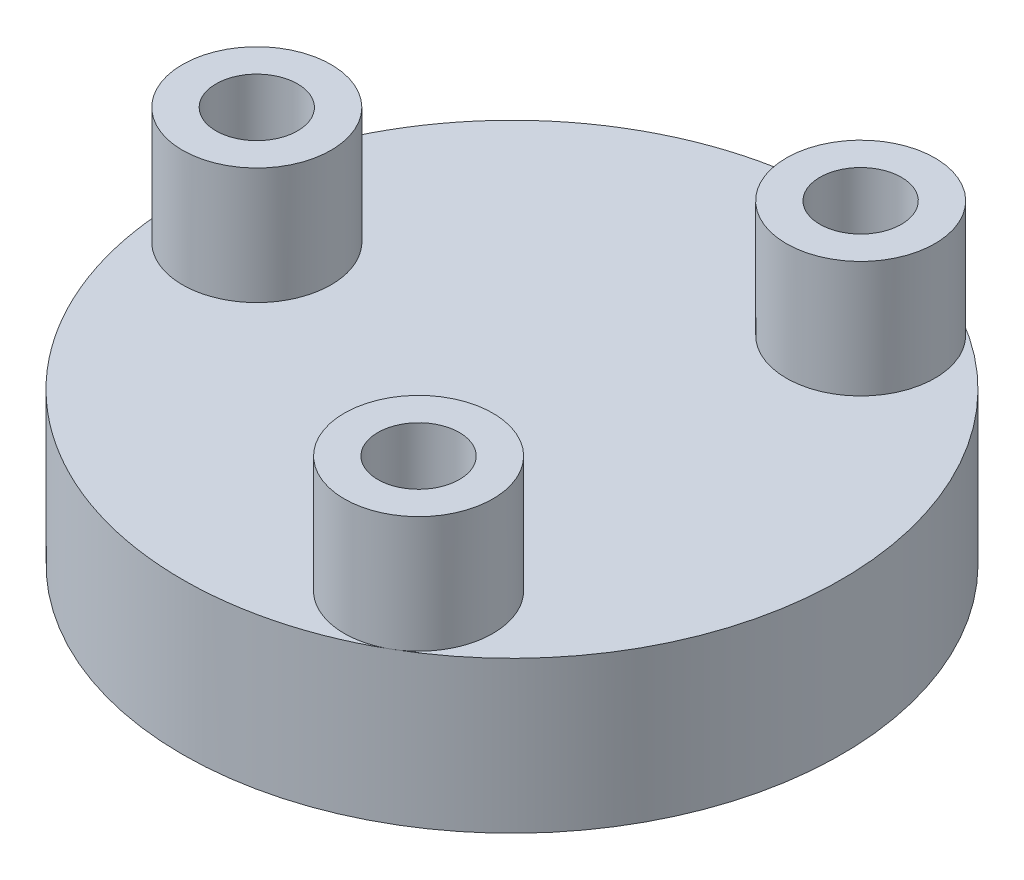
ISO-10303-21;
HEADER;
FILE_DESCRIPTION(('STEP AP214'),'2;1');
FILE_NAME('part.step','',(''),(''),'','','');
FILE_SCHEMA(('AUTOMOTIVE_DESIGN { 1 0 10303 214 1 1 1 1 }'));
ENDSEC;
DATA;
#1=APPLICATION_CONTEXT('core data for automotive mechanical design processes');
#2=APPLICATION_PROTOCOL_DEFINITION('international standard','automotive_design',2000,#1);
#3=PRODUCT_CONTEXT('',#1,'mechanical');
#4=PRODUCT('Part','Part','',(#3));
#5=PRODUCT_RELATED_PRODUCT_CATEGORY('part','',(#4));
#6=PRODUCT_DEFINITION_FORMATION('','',#4);
#7=PRODUCT_DEFINITION_CONTEXT('part definition',#1,'design');
#8=PRODUCT_DEFINITION('design','',#6,#7);
#9=PRODUCT_DEFINITION_SHAPE('','',#8);
#10=(LENGTH_UNIT() NAMED_UNIT(*) SI_UNIT(.MILLI.,.METRE.));
#11=(NAMED_UNIT(*) PLANE_ANGLE_UNIT() SI_UNIT($,.RADIAN.));
#12=(NAMED_UNIT(*) SI_UNIT($,.STERADIAN.) SOLID_ANGLE_UNIT());
#13=UNCERTAINTY_MEASURE_WITH_UNIT(LENGTH_MEASURE(1.E-05),#10,'distance_accuracy_value','');
#14=(GEOMETRIC_REPRESENTATION_CONTEXT(3) GLOBAL_UNCERTAINTY_ASSIGNED_CONTEXT((#13)) GLOBAL_UNIT_ASSIGNED_CONTEXT((#10,
#11,#12)) REPRESENTATION_CONTEXT('',''));
#15=CARTESIAN_POINT('',(0.,0.,0.));
#16=DIRECTION('',(0.,0.,1.));
#17=DIRECTION('',(1.,0.,0.));
#18=AXIS2_PLACEMENT_3D('',#15,#16,#17);
#19=CARTESIAN_POINT('',(0.,0.,0.));
#20=DIRECTION('',(0.,1.,0.));
#21=DIRECTION('',(0.,0.,1.));
#22=AXIS2_PLACEMENT_3D('',#19,#20,#21);
#23=PLANE('',#22);
#24=CARTESIAN_POINT('',(-21.9,0.,0.));
#25=DIRECTION('',(0.,-1.,0.));
#26=DIRECTION('',(0.,0.,-1.));
#27=AXIS2_PLACEMENT_3D('',#24,#25,#26);
#28=CIRCLE('',#27,3.5);
#29=CARTESIAN_POINT('',(-21.9,0.,-3.5));
#30=VERTEX_POINT('',#29);
#31=EDGE_CURVE('E113',#30,#30,#28,.T.);
#32=ORIENTED_EDGE('',*,*,#31,.F.);
#33=EDGE_LOOP('',(#32));
#34=FACE_BOUND('',#33,.T.);
#35=CARTESIAN_POINT('',(10.95,0.,18.9659563428792));
#36=DIRECTION('',(0.,-1.,0.));
#37=DIRECTION('',(0.,0.,-1.));
#38=AXIS2_PLACEMENT_3D('',#35,#36,#37);
#39=CIRCLE('',#38,3.5);
#40=CARTESIAN_POINT('',(10.95,0.,15.4659563428792));
#41=VERTEX_POINT('',#40);
#42=EDGE_CURVE('E117',#41,#41,#39,.T.);
#43=ORIENTED_EDGE('',*,*,#42,.F.);
#44=EDGE_LOOP('',(#43));
#45=FACE_BOUND('',#44,.T.);
#46=CARTESIAN_POINT('',(0.,0.,0.));
#47=DIRECTION('',(0.,1.,0.));
#48=DIRECTION('',(0.,0.,1.));
#49=AXIS2_PLACEMENT_3D('',#46,#47,#48);
#50=CIRCLE('',#49,28.275);
#51=CARTESIAN_POINT('',(0.,0.,28.275));
#52=VERTEX_POINT('',#51);
#53=EDGE_CURVE('E46',#52,#52,#50,.T.);
#54=ORIENTED_EDGE('',*,*,#53,.F.);
#55=EDGE_LOOP('',(#54));
#56=FACE_BOUND('',#55,.T.);
#57=CARTESIAN_POINT('',(10.95,0.,-18.9659563428792));
#58=DIRECTION('',(0.,-1.,0.));
#59=DIRECTION('',(0.,0.,-1.));
#60=AXIS2_PLACEMENT_3D('',#57,#58,#59);
#61=CIRCLE('',#60,3.5);
#62=CARTESIAN_POINT('',(10.95,0.,-22.4659563428792));
#63=VERTEX_POINT('',#62);
#64=EDGE_CURVE('E123',#63,#63,#61,.T.);
#65=ORIENTED_EDGE('',*,*,#64,.F.);
#66=EDGE_LOOP('',(#65));
#67=FACE_BOUND('',#66,.T.);
#68=ADVANCED_FACE('F42',(#34,#45,#56,#67),#23,.F.);
#69=CARTESIAN_POINT('',(0.,13.,0.));
#70=DIRECTION('',(0.,-1.,0.));
#71=DIRECTION('',(0.,0.,-1.));
#72=AXIS2_PLACEMENT_3D('',#69,#70,#71);
#73=CYLINDRICAL_SURFACE('',#72,28.275);
#74=CARTESIAN_POINT('',(0.,13.,0.));
#75=DIRECTION('',(0.,1.,0.));
#76=DIRECTION('',(0.,0.,1.));
#77=AXIS2_PLACEMENT_3D('',#74,#75,#76);
#78=CIRCLE('',#77,28.275);
#79=CARTESIAN_POINT('',(-28.275,13.,0.));
#80=VERTEX_POINT('',#79);
#81=CARTESIAN_POINT('',(14.1375,13.,24.486868292005));
#82=VERTEX_POINT('',#81);
#83=EDGE_CURVE('E11',#80,#82,#78,.T.);
#84=ORIENTED_EDGE('',*,*,#83,.F.);
#85=CARTESIAN_POINT('',(14.1375,13.,-24.486868292005));
#86=VERTEX_POINT('',#85);
#87=EDGE_CURVE('E52',#86,#80,#78,.T.);
#88=ORIENTED_EDGE('',*,*,#87,.F.);
#89=EDGE_CURVE('E51',#82,#86,#78,.T.);
#90=ORIENTED_EDGE('',*,*,#89,.F.);
#91=EDGE_LOOP('',(#84,#88,#90));
#92=FACE_BOUND('',#91,.T.);
#93=ORIENTED_EDGE('',*,*,#53,.T.);
#94=EDGE_LOOP('',(#93));
#95=FACE_BOUND('',#94,.T.);
#96=ADVANCED_FACE('F44',(#92,#95),#73,.T.);
#97=CARTESIAN_POINT('',(0.,13.,0.));
#98=DIRECTION('',(0.,1.,0.));
#99=DIRECTION('',(0.,0.,1.));
#100=AXIS2_PLACEMENT_3D('',#97,#98,#99);
#101=PLANE('',#100);
#102=ORIENTED_EDGE('',*,*,#83,.T.);
#103=CARTESIAN_POINT('',(10.95,13.,18.9659563428792));
#104=DIRECTION('',(0.,1.,0.));
#105=DIRECTION('',(0.,0.,1.));
#106=AXIS2_PLACEMENT_3D('',#103,#104,#105);
#107=CIRCLE('',#106,6.375);
#108=EDGE_CURVE('E57',#82,#82,#107,.T.);
#109=ORIENTED_EDGE('',*,*,#108,.F.);
#110=ORIENTED_EDGE('',*,*,#89,.T.);
#111=CARTESIAN_POINT('',(10.95,13.,-18.9659563428792));
#112=DIRECTION('',(0.,1.,0.));
#113=DIRECTION('',(0.,0.,1.));
#114=AXIS2_PLACEMENT_3D('',#111,#112,#113);
#115=CIRCLE('',#114,6.375);
#116=EDGE_CURVE('E72',#86,#86,#115,.T.);
#117=ORIENTED_EDGE('',*,*,#116,.F.);
#118=ORIENTED_EDGE('',*,*,#87,.T.);
#119=CARTESIAN_POINT('',(-21.9,13.,0.));
#120=DIRECTION('',(0.,1.,0.));
#121=DIRECTION('',(0.,0.,1.));
#122=AXIS2_PLACEMENT_3D('',#119,#120,#121);
#123=CIRCLE('',#122,6.375);
#124=EDGE_CURVE('E71',#80,#80,#123,.T.);
#125=ORIENTED_EDGE('',*,*,#124,.F.);
#126=EDGE_LOOP('',(#102,#109,#110,#117,#118,#125));
#127=FACE_BOUND('',#126,.T.);
#128=ADVANCED_FACE('F69',(#127),#101,.T.);
#129=CARTESIAN_POINT('',(-21.9,23.,0.));
#130=DIRECTION('',(0.,-1.,0.));
#131=DIRECTION('',(0.,0.,-1.));
#132=AXIS2_PLACEMENT_3D('',#129,#130,#131);
#133=CYLINDRICAL_SURFACE('',#132,6.375);
#134=CARTESIAN_POINT('',(-21.9,23.,0.));
#135=DIRECTION('',(0.,1.,0.));
#136=DIRECTION('',(0.,0.,1.));
#137=AXIS2_PLACEMENT_3D('',#134,#135,#136);
#138=CIRCLE('',#137,6.375);
#139=CARTESIAN_POINT('',(-21.9,23.,6.375));
#140=VERTEX_POINT('',#139);
#141=EDGE_CURVE('E87',#140,#140,#138,.T.);
#142=ORIENTED_EDGE('',*,*,#141,.F.);
#143=EDGE_LOOP('',(#142));
#144=FACE_BOUND('',#143,.T.);
#145=ORIENTED_EDGE('',*,*,#124,.T.);
#146=EDGE_LOOP('',(#145));
#147=FACE_BOUND('',#146,.T.);
#148=ADVANCED_FACE('F91',(#144,#147),#133,.T.);
#149=CARTESIAN_POINT('',(-21.9,23.,0.));
#150=DIRECTION('',(0.,1.,0.));
#151=DIRECTION('',(0.,0.,1.));
#152=AXIS2_PLACEMENT_3D('',#149,#150,#151);
#153=PLANE('',#152);
#154=CARTESIAN_POINT('',(-21.9,23.,0.));
#155=DIRECTION('',(0.,-1.,0.));
#156=DIRECTION('',(0.,0.,-1.));
#157=AXIS2_PLACEMENT_3D('',#154,#155,#156);
#158=CIRCLE('',#157,3.5);
#159=CARTESIAN_POINT('',(-21.9,23.,-3.5));
#160=VERTEX_POINT('',#159);
#161=EDGE_CURVE('E126',#160,#160,#158,.T.);
#162=ORIENTED_EDGE('',*,*,#161,.T.);
#163=EDGE_LOOP('',(#162));
#164=FACE_BOUND('',#163,.T.);
#165=ORIENTED_EDGE('',*,*,#141,.T.);
#166=EDGE_LOOP('',(#165));
#167=FACE_BOUND('',#166,.T.);
#168=ADVANCED_FACE('F93',(#164,#167),#153,.T.);
#169=CARTESIAN_POINT('',(10.95,23.,-18.9659563428792));
#170=DIRECTION('',(0.,-1.,0.));
#171=DIRECTION('',(0.,0.,-1.));
#172=AXIS2_PLACEMENT_3D('',#169,#170,#171);
#173=CYLINDRICAL_SURFACE('',#172,6.375);
#174=CARTESIAN_POINT('',(10.95,23.,-18.9659563428792));
#175=DIRECTION('',(0.,1.,0.));
#176=DIRECTION('',(0.,0.,1.));
#177=AXIS2_PLACEMENT_3D('',#174,#175,#176);
#178=CIRCLE('',#177,6.375);
#179=CARTESIAN_POINT('',(10.95,23.,-12.5909563428792));
#180=VERTEX_POINT('',#179);
#181=EDGE_CURVE('E75',#180,#180,#178,.T.);
#182=ORIENTED_EDGE('',*,*,#181,.F.);
#183=EDGE_LOOP('',(#182));
#184=FACE_BOUND('',#183,.T.);
#185=ORIENTED_EDGE('',*,*,#116,.T.);
#186=EDGE_LOOP('',(#185));
#187=FACE_BOUND('',#186,.T.);
#188=ADVANCED_FACE('F100',(#184,#187),#173,.T.);
#189=CARTESIAN_POINT('',(10.95,23.,-18.9659563428792));
#190=DIRECTION('',(0.,1.,0.));
#191=DIRECTION('',(0.,0.,1.));
#192=AXIS2_PLACEMENT_3D('',#189,#190,#191);
#193=PLANE('',#192);
#194=CARTESIAN_POINT('',(10.95,23.,-18.9659563428792));
#195=DIRECTION('',(0.,-1.,0.));
#196=DIRECTION('',(0.,0.,-1.));
#197=AXIS2_PLACEMENT_3D('',#194,#195,#196);
#198=CIRCLE('',#197,3.49999999999999);
#199=CARTESIAN_POINT('',(10.95,23.,-22.4659563428792));
#200=VERTEX_POINT('',#199);
#201=EDGE_CURVE('E125',#200,#200,#198,.T.);
#202=ORIENTED_EDGE('',*,*,#201,.T.);
#203=EDGE_LOOP('',(#202));
#204=FACE_BOUND('',#203,.T.);
#205=ORIENTED_EDGE('',*,*,#181,.T.);
#206=EDGE_LOOP('',(#205));
#207=FACE_BOUND('',#206,.T.);
#208=ADVANCED_FACE('F156',(#204,#207),#193,.T.);
#209=CARTESIAN_POINT('',(10.95,23.,18.9659563428792));
#210=DIRECTION('',(0.,-1.,0.));
#211=DIRECTION('',(0.,0.,-1.));
#212=AXIS2_PLACEMENT_3D('',#209,#210,#211);
#213=CYLINDRICAL_SURFACE('',#212,6.375);
#214=CARTESIAN_POINT('',(10.95,23.,18.9659563428792));
#215=DIRECTION('',(0.,1.,0.));
#216=DIRECTION('',(0.,0.,1.));
#217=AXIS2_PLACEMENT_3D('',#214,#215,#216);
#218=CIRCLE('',#217,6.375);
#219=CARTESIAN_POINT('',(10.95,23.,25.3409563428792));
#220=VERTEX_POINT('',#219);
#221=EDGE_CURVE('E76',#220,#220,#218,.T.);
#222=ORIENTED_EDGE('',*,*,#221,.F.);
#223=EDGE_LOOP('',(#222));
#224=FACE_BOUND('',#223,.T.);
#225=ORIENTED_EDGE('',*,*,#108,.T.);
#226=EDGE_LOOP('',(#225));
#227=FACE_BOUND('',#226,.T.);
#228=ADVANCED_FACE('F151',(#224,#227),#213,.T.);
#229=CARTESIAN_POINT('',(10.95,23.,18.9659563428792));
#230=DIRECTION('',(0.,1.,0.));
#231=DIRECTION('',(0.,0.,1.));
#232=AXIS2_PLACEMENT_3D('',#229,#230,#231);
#233=PLANE('',#232);
#234=CARTESIAN_POINT('',(10.95,23.,18.9659563428792));
#235=DIRECTION('',(0.,-1.,0.));
#236=DIRECTION('',(0.,0.,-1.));
#237=AXIS2_PLACEMENT_3D('',#234,#235,#236);
#238=CIRCLE('',#237,3.49999999999999);
#239=CARTESIAN_POINT('',(10.95,23.,15.4659563428792));
#240=VERTEX_POINT('',#239);
#241=EDGE_CURVE('E81',#240,#240,#238,.T.);
#242=ORIENTED_EDGE('',*,*,#241,.T.);
#243=EDGE_LOOP('',(#242));
#244=FACE_BOUND('',#243,.T.);
#245=ORIENTED_EDGE('',*,*,#221,.T.);
#246=EDGE_LOOP('',(#245));
#247=FACE_BOUND('',#246,.T.);
#248=ADVANCED_FACE('F137',(#244,#247),#233,.T.);
#249=CARTESIAN_POINT('',(10.95,0.,18.9659563428792));
#250=DIRECTION('',(0.,-1.,0.));
#251=DIRECTION('',(0.,0.,-1.));
#252=AXIS2_PLACEMENT_3D('',#249,#250,#251);
#253=CYLINDRICAL_SURFACE('',#252,3.5);
#254=ORIENTED_EDGE('',*,*,#241,.F.);
#255=EDGE_LOOP('',(#254));
#256=FACE_BOUND('',#255,.T.);
#257=ORIENTED_EDGE('',*,*,#42,.T.);
#258=EDGE_LOOP('',(#257));
#259=FACE_BOUND('',#258,.T.);
#260=ADVANCED_FACE('F140',(#256,#259),#253,.F.);
#261=CARTESIAN_POINT('',(10.95,0.,-18.9659563428792));
#262=DIRECTION('',(0.,-1.,0.));
#263=DIRECTION('',(0.,0.,-1.));
#264=AXIS2_PLACEMENT_3D('',#261,#262,#263);
#265=CYLINDRICAL_SURFACE('',#264,3.5);
#266=ORIENTED_EDGE('',*,*,#201,.F.);
#267=EDGE_LOOP('',(#266));
#268=FACE_BOUND('',#267,.T.);
#269=ORIENTED_EDGE('',*,*,#64,.T.);
#270=EDGE_LOOP('',(#269));
#271=FACE_BOUND('',#270,.T.);
#272=ADVANCED_FACE('F142',(#268,#271),#265,.F.);
#273=CARTESIAN_POINT('',(-21.9,0.,0.));
#274=DIRECTION('',(0.,-1.,0.));
#275=DIRECTION('',(0.,0.,-1.));
#276=AXIS2_PLACEMENT_3D('',#273,#274,#275);
#277=CYLINDRICAL_SURFACE('',#276,3.5);
#278=ORIENTED_EDGE('',*,*,#161,.F.);
#279=EDGE_LOOP('',(#278));
#280=FACE_BOUND('',#279,.T.);
#281=ORIENTED_EDGE('',*,*,#31,.T.);
#282=EDGE_LOOP('',(#281));
#283=FACE_BOUND('',#282,.T.);
#284=ADVANCED_FACE('F148',(#280,#283),#277,.F.);
#285=CLOSED_SHELL('',(#68,#96,#128,#148,#168,#188,#208,#228,#248,#260,#272,#284));
#286=MANIFOLD_SOLID_BREP('B2',#285);
#287=ADVANCED_BREP_SHAPE_REPRESENTATION('',(#18,#286),#14);
#288=SHAPE_DEFINITION_REPRESENTATION(#9,#287);
ENDSEC;
END-ISO-10303-21;
